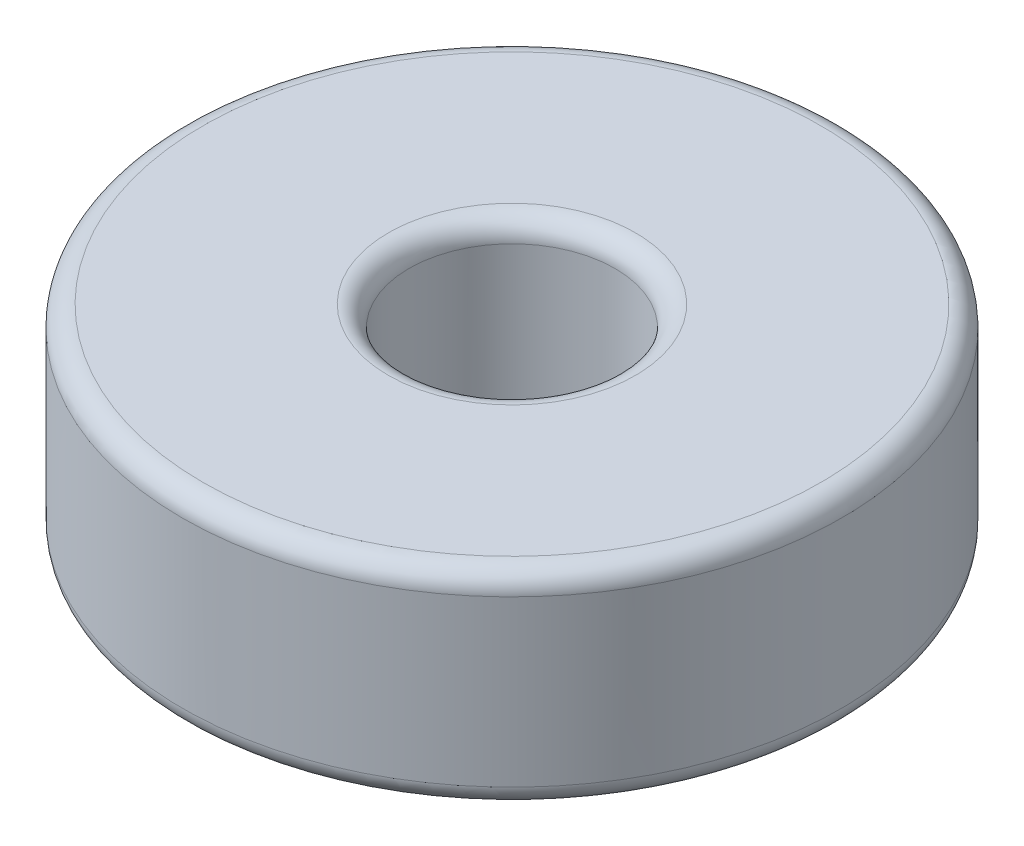
ISO-10303-21;
HEADER;
FILE_DESCRIPTION(('STEP AP214'),'2;1');
FILE_NAME('part.step','',(''),(''),'','','');
FILE_SCHEMA(('AUTOMOTIVE_DESIGN { 1 0 10303 214 1 1 1 1 }'));
ENDSEC;
DATA;
#1=APPLICATION_CONTEXT('core data for automotive mechanical design processes');
#2=APPLICATION_PROTOCOL_DEFINITION('international standard','automotive_design',2000,#1);
#3=PRODUCT_CONTEXT('',#1,'mechanical');
#4=PRODUCT('Part','Part','',(#3));
#5=PRODUCT_RELATED_PRODUCT_CATEGORY('part','',(#4));
#6=PRODUCT_DEFINITION_FORMATION('','',#4);
#7=PRODUCT_DEFINITION_CONTEXT('part definition',#1,'design');
#8=PRODUCT_DEFINITION('design','',#6,#7);
#9=PRODUCT_DEFINITION_SHAPE('','',#8);
#10=(LENGTH_UNIT() NAMED_UNIT(*) SI_UNIT(.MILLI.,.METRE.));
#11=(NAMED_UNIT(*) PLANE_ANGLE_UNIT() SI_UNIT($,.RADIAN.));
#12=(NAMED_UNIT(*) SI_UNIT($,.STERADIAN.) SOLID_ANGLE_UNIT());
#13=UNCERTAINTY_MEASURE_WITH_UNIT(LENGTH_MEASURE(1.E-05),#10,'distance_accuracy_value','');
#14=(GEOMETRIC_REPRESENTATION_CONTEXT(3) GLOBAL_UNCERTAINTY_ASSIGNED_CONTEXT((#13)) GLOBAL_UNIT_ASSIGNED_CONTEXT((#10,
#11,#12)) REPRESENTATION_CONTEXT('',''));
#15=CARTESIAN_POINT('',(0.,0.,0.));
#16=DIRECTION('',(0.,0.,1.));
#17=DIRECTION('',(1.,0.,0.));
#18=AXIS2_PLACEMENT_3D('',#15,#16,#17);
#19=CARTESIAN_POINT('',(8.,0.,0.));
#20=DIRECTION('',(0.,-1.,0.));
#21=DIRECTION('',(0.,0.,-1.));
#22=AXIS2_PLACEMENT_3D('',#19,#20,#21);
#23=PLANE('',#22);
#24=CARTESIAN_POINT('',(0.,0.,0.));
#25=DIRECTION('',(0.,-1.,0.));
#26=DIRECTION('',(0.,0.,-1.));
#27=AXIS2_PLACEMENT_3D('',#24,#25,#26);
#28=CIRCLE('',#27,3.);
#29=CARTESIAN_POINT('',(0.,0.,-3.));
#30=VERTEX_POINT('',#29);
#31=EDGE_CURVE('E52',#30,#30,#28,.F.);
#32=ORIENTED_EDGE('',*,*,#31,.T.);
#33=EDGE_LOOP('',(#32));
#34=FACE_BOUND('',#33,.T.);
#35=CARTESIAN_POINT('',(0.,0.,0.));
#36=DIRECTION('',(0.,-1.,0.));
#37=DIRECTION('',(0.,0.,-1.));
#38=AXIS2_PLACEMENT_3D('',#35,#36,#37);
#39=CIRCLE('',#38,7.5);
#40=CARTESIAN_POINT('',(0.,0.,-7.5));
#41=VERTEX_POINT('',#40);
#42=EDGE_CURVE('E55',#41,#41,#39,.T.);
#43=ORIENTED_EDGE('',*,*,#42,.T.);
#44=EDGE_LOOP('',(#43));
#45=FACE_BOUND('',#44,.T.);
#46=ADVANCED_FACE('F32',(#34,#45),#23,.T.);
#47=CARTESIAN_POINT('',(0.,0.,0.));
#48=DIRECTION('',(0.,-1.,0.));
#49=DIRECTION('',(0.,0.,-1.));
#50=AXIS2_PLACEMENT_3D('',#47,#48,#49);
#51=CYLINDRICAL_SURFACE('',#50,2.5);
#52=CARTESIAN_POINT('',(0.,0.499999999999996,0.));
#53=DIRECTION('',(0.,-1.,0.));
#54=DIRECTION('',(0.,0.,-1.));
#55=AXIS2_PLACEMENT_3D('',#52,#53,#54);
#56=CIRCLE('',#55,2.5);
#57=CARTESIAN_POINT('',(0.,0.499999999999996,-2.5));
#58=VERTEX_POINT('',#57);
#59=EDGE_CURVE('E58',#58,#58,#56,.T.);
#60=ORIENTED_EDGE('',*,*,#59,.T.);
#61=EDGE_LOOP('',(#60));
#62=FACE_BOUND('',#61,.T.);
#63=CARTESIAN_POINT('',(0.,4.5,0.));
#64=DIRECTION('',(0.,1.,0.));
#65=DIRECTION('',(0.,0.,1.));
#66=AXIS2_PLACEMENT_3D('',#63,#64,#65);
#67=CIRCLE('',#66,2.5);
#68=CARTESIAN_POINT('',(0.,4.5,2.5));
#69=VERTEX_POINT('',#68);
#70=EDGE_CURVE('E61',#69,#69,#67,.T.);
#71=ORIENTED_EDGE('',*,*,#70,.T.);
#72=EDGE_LOOP('',(#71));
#73=FACE_BOUND('',#72,.T.);
#74=ADVANCED_FACE('F65',(#62,#73),#51,.F.);
#75=CARTESIAN_POINT('',(2.5,5.,0.));
#76=DIRECTION('',(0.,1.,0.));
#77=DIRECTION('',(0.,0.,1.));
#78=AXIS2_PLACEMENT_3D('',#75,#76,#77);
#79=PLANE('',#78);
#80=CARTESIAN_POINT('',(0.,5.,0.));
#81=DIRECTION('',(0.,1.,0.));
#82=DIRECTION('',(0.,0.,1.));
#83=AXIS2_PLACEMENT_3D('',#80,#81,#82);
#84=CIRCLE('',#83,7.5);
#85=CARTESIAN_POINT('',(0.,5.,7.5));
#86=VERTEX_POINT('',#85);
#87=EDGE_CURVE('E10',#86,#86,#84,.T.);
#88=ORIENTED_EDGE('',*,*,#87,.T.);
#89=EDGE_LOOP('',(#88));
#90=FACE_BOUND('',#89,.T.);
#91=CARTESIAN_POINT('',(0.,5.,0.));
#92=DIRECTION('',(0.,1.,0.));
#93=DIRECTION('',(0.,0.,1.));
#94=AXIS2_PLACEMENT_3D('',#91,#92,#93);
#95=CIRCLE('',#94,3.);
#96=CARTESIAN_POINT('',(0.,5.,3.));
#97=VERTEX_POINT('',#96);
#98=EDGE_CURVE('E39',#97,#97,#95,.F.);
#99=ORIENTED_EDGE('',*,*,#98,.T.);
#100=EDGE_LOOP('',(#99));
#101=FACE_BOUND('',#100,.T.);
#102=ADVANCED_FACE('F81',(#90,#101),#79,.T.);
#103=CARTESIAN_POINT('',(0.,0.,0.));
#104=DIRECTION('',(0.,-1.,0.));
#105=DIRECTION('',(0.,0.,-1.));
#106=AXIS2_PLACEMENT_3D('',#103,#104,#105);
#107=CYLINDRICAL_SURFACE('',#106,8.);
#108=CARTESIAN_POINT('',(0.,0.499999999999996,0.));
#109=DIRECTION('',(0.,-1.,0.));
#110=DIRECTION('',(0.,0.,-1.));
#111=AXIS2_PLACEMENT_3D('',#108,#109,#110);
#112=CIRCLE('',#111,8.);
#113=CARTESIAN_POINT('',(0.,0.499999999999996,-8.));
#114=VERTEX_POINT('',#113);
#115=EDGE_CURVE('E43',#114,#114,#112,.F.);
#116=ORIENTED_EDGE('',*,*,#115,.T.);
#117=EDGE_LOOP('',(#116));
#118=FACE_BOUND('',#117,.T.);
#119=CARTESIAN_POINT('',(0.,4.5,0.));
#120=DIRECTION('',(0.,1.,0.));
#121=DIRECTION('',(0.,0.,1.));
#122=AXIS2_PLACEMENT_3D('',#119,#120,#121);
#123=CIRCLE('',#122,8.);
#124=CARTESIAN_POINT('',(0.,4.5,8.));
#125=VERTEX_POINT('',#124);
#126=EDGE_CURVE('E47',#125,#125,#123,.F.);
#127=ORIENTED_EDGE('',*,*,#126,.T.);
#128=EDGE_LOOP('',(#127));
#129=FACE_BOUND('',#128,.T.);
#130=ADVANCED_FACE('F90',(#118,#129),#107,.T.);
#131=CARTESIAN_POINT('',(0.,0.499999999999996,0.));
#132=DIRECTION('',(0.,-1.,0.));
#133=DIRECTION('',(0.,0.,-1.));
#134=AXIS2_PLACEMENT_3D('',#131,#132,#133);
#135=TOROIDAL_SURFACE('',#134,3.,0.5);
#136=ORIENTED_EDGE('',*,*,#31,.F.);
#137=EDGE_LOOP('',(#136));
#138=FACE_BOUND('',#137,.T.);
#139=ORIENTED_EDGE('',*,*,#59,.F.);
#140=EDGE_LOOP('',(#139));
#141=FACE_BOUND('',#140,.T.);
#142=ADVANCED_FACE('F87',(#138,#141),#135,.T.);
#143=CARTESIAN_POINT('',(0.,0.499999999999996,0.));
#144=DIRECTION('',(0.,-1.,0.));
#145=DIRECTION('',(0.,0.,-1.));
#146=AXIS2_PLACEMENT_3D('',#143,#144,#145);
#147=TOROIDAL_SURFACE('',#146,7.5,0.5);
#148=ORIENTED_EDGE('',*,*,#115,.F.);
#149=EDGE_LOOP('',(#148));
#150=FACE_BOUND('',#149,.T.);
#151=ORIENTED_EDGE('',*,*,#42,.F.);
#152=EDGE_LOOP('',(#151));
#153=FACE_BOUND('',#152,.T.);
#154=ADVANCED_FACE('F73',(#150,#153),#147,.T.);
#155=CARTESIAN_POINT('',(0.,4.5,0.));
#156=DIRECTION('',(0.,1.,0.));
#157=DIRECTION('',(0.,0.,1.));
#158=AXIS2_PLACEMENT_3D('',#155,#156,#157);
#159=TOROIDAL_SURFACE('',#158,7.5,0.5);
#160=ORIENTED_EDGE('',*,*,#87,.F.);
#161=EDGE_LOOP('',(#160));
#162=FACE_BOUND('',#161,.T.);
#163=ORIENTED_EDGE('',*,*,#126,.F.);
#164=EDGE_LOOP('',(#163));
#165=FACE_BOUND('',#164,.T.);
#166=ADVANCED_FACE('F69',(#162,#165),#159,.T.);
#167=CARTESIAN_POINT('',(0.,4.5,0.));
#168=DIRECTION('',(0.,1.,0.));
#169=DIRECTION('',(0.,0.,1.));
#170=AXIS2_PLACEMENT_3D('',#167,#168,#169);
#171=TOROIDAL_SURFACE('',#170,3.,0.5);
#172=ORIENTED_EDGE('',*,*,#70,.F.);
#173=EDGE_LOOP('',(#172));
#174=FACE_BOUND('',#173,.T.);
#175=ORIENTED_EDGE('',*,*,#98,.F.);
#176=EDGE_LOOP('',(#175));
#177=FACE_BOUND('',#176,.T.);
#178=ADVANCED_FACE('F34',(#174,#177),#171,.T.);
#179=CLOSED_SHELL('',(#46,#74,#102,#130,#142,#154,#166,#178));
#180=MANIFOLD_SOLID_BREP('B2',#179);
#181=ADVANCED_BREP_SHAPE_REPRESENTATION('',(#18,#180),#14);
#182=SHAPE_DEFINITION_REPRESENTATION(#9,#181);
ENDSEC;
END-ISO-10303-21;
